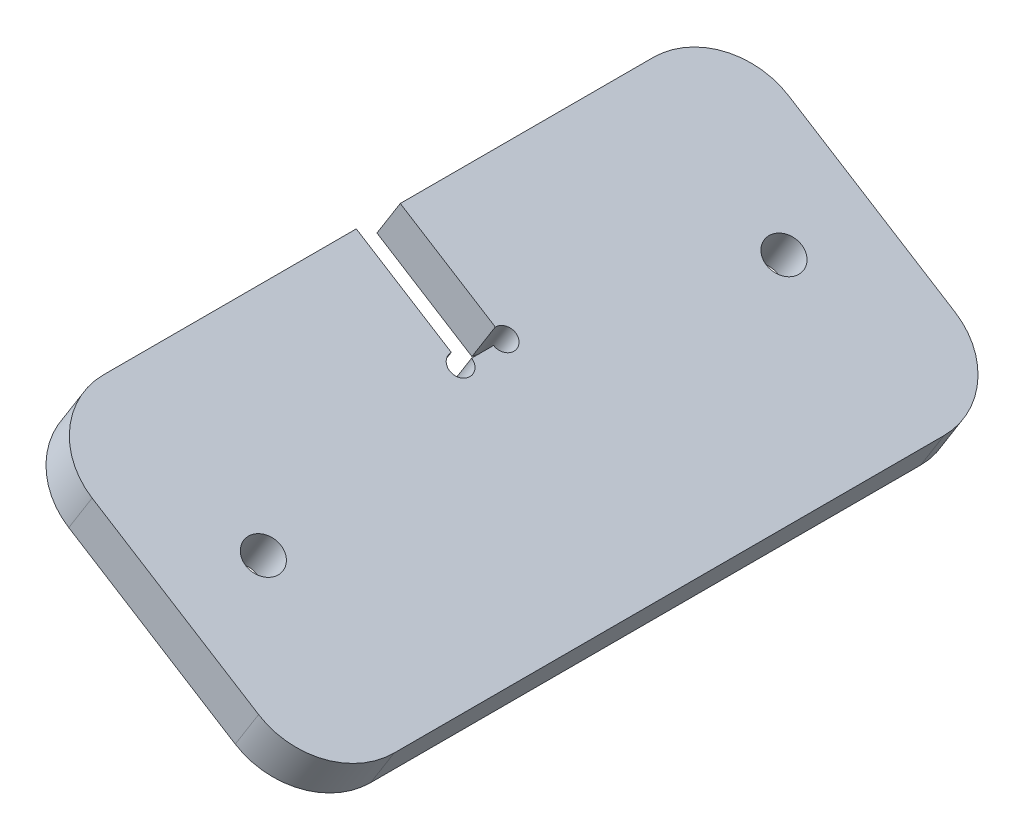
ISO-10303-21;
HEADER;
FILE_DESCRIPTION(('STEP AP214'),'2;1');
FILE_NAME('part.step','',(''),(''),'','','');
FILE_SCHEMA(('AUTOMOTIVE_DESIGN { 1 0 10303 214 1 1 1 1 }'));
ENDSEC;
DATA;
#1=APPLICATION_CONTEXT('core data for automotive mechanical design processes');
#2=APPLICATION_PROTOCOL_DEFINITION('international standard','automotive_design',2000,#1);
#3=PRODUCT_CONTEXT('',#1,'mechanical');
#4=PRODUCT('Part','Part','',(#3));
#5=PRODUCT_RELATED_PRODUCT_CATEGORY('part','',(#4));
#6=PRODUCT_DEFINITION_FORMATION('','',#4);
#7=PRODUCT_DEFINITION_CONTEXT('part definition',#1,'design');
#8=PRODUCT_DEFINITION('design','',#6,#7);
#9=PRODUCT_DEFINITION_SHAPE('','',#8);
#10=(LENGTH_UNIT() NAMED_UNIT(*) SI_UNIT(.MILLI.,.METRE.));
#11=(NAMED_UNIT(*) PLANE_ANGLE_UNIT() SI_UNIT($,.RADIAN.));
#12=(NAMED_UNIT(*) SI_UNIT($,.STERADIAN.) SOLID_ANGLE_UNIT());
#13=UNCERTAINTY_MEASURE_WITH_UNIT(LENGTH_MEASURE(1.E-05),#10,'distance_accuracy_value','');
#14=(GEOMETRIC_REPRESENTATION_CONTEXT(3) GLOBAL_UNCERTAINTY_ASSIGNED_CONTEXT((#13)) GLOBAL_UNIT_ASSIGNED_CONTEXT((#10,
#11,#12)) REPRESENTATION_CONTEXT('',''));
#15=CARTESIAN_POINT('',(0.,0.,0.));
#16=DIRECTION('',(0.,0.,1.));
#17=DIRECTION('',(1.,0.,0.));
#18=AXIS2_PLACEMENT_3D('',#15,#16,#17);
#19=CARTESIAN_POINT('',(698.573213094909,153.841859890101,54.9944512539106));
#20=DIRECTION('',(0.847559563503061,-0.530700279173188,0.));
#21=DIRECTION('',(0.530700279173188,0.847559563503061,0.));
#22=AXIS2_PLACEMENT_3D('',#19,#20,#21);
#23=PLANE('',#22);
#24=DIRECTION('',(0.,0.,-1.));
#25=VECTOR('',#24,1.);
#26=CARTESIAN_POINT('',(701.757414769948,158.92721727112,54.9944512539106));
#27=LINE('',#26,#25);
#28=CARTESIAN_POINT('',(701.757414769948,158.92721727112,-26.4999999999998));
#29=VERTEX_POINT('',#28);
#30=CARTESIAN_POINT('',(701.757414769948,158.92721727112,-29.4999999999995));
#31=VERTEX_POINT('',#30);
#32=EDGE_CURVE('E154',#29,#31,#27,.T.);
#33=ORIENTED_EDGE('',*,*,#32,.T.);
#34=DIRECTION('',(0.530700279173189,0.847559563503061,0.));
#35=VECTOR('',#34,1.);
#36=CARTESIAN_POINT('',(687.405090474651,136.005711117161,-29.4999999999995));
#37=LINE('',#36,#35);
#38=CARTESIAN_POINT('',(698.573213094909,153.841859890102,-29.4999999999995));
#39=VERTEX_POINT('',#38);
#40=EDGE_CURVE('E275',#31,#39,#37,.F.);
#41=ORIENTED_EDGE('',*,*,#40,.T.);
#42=DIRECTION('',(0.,0.,-1.));
#43=VECTOR('',#42,1.);
#44=CARTESIAN_POINT('',(698.573213094909,153.841859890101,54.9944512539106));
#45=LINE('',#44,#43);
#46=CARTESIAN_POINT('',(698.573213094909,153.841859890102,-26.4999999999998));
#47=VERTEX_POINT('',#46);
#48=EDGE_CURVE('E211',#47,#39,#45,.T.);
#49=ORIENTED_EDGE('',*,*,#48,.F.);
#50=DIRECTION('',(0.530700279173189,0.847559563503061,0.));
#51=VECTOR('',#50,1.);
#52=CARTESIAN_POINT('',(687.405090474651,136.005711117161,-26.4999999999998));
#53=LINE('',#52,#51);
#54=EDGE_CURVE('E289',#47,#29,#53,.T.);
#55=ORIENTED_EDGE('',*,*,#54,.T.);
#56=EDGE_LOOP('',(#33,#41,#49,#55));
#57=FACE_BOUND('',#56,.T.);
#58=ADVANCED_FACE('F36',(#57),#23,.F.);
#59=CARTESIAN_POINT('',(724.,137.920851514906,54.9944512539106));
#60=DIRECTION('',(-0.847559563503063,0.530700279173186,0.));
#61=DIRECTION('',(-0.530700279173186,-0.847559563503063,0.));
#62=AXIS2_PLACEMENT_3D('',#59,#60,#61);
#63=PLANE('',#62);
#64=DIRECTION('',(0.,0.,-1.));
#65=VECTOR('',#64,1.);
#66=CARTESIAN_POINT('',(724.,137.920851514906,54.9944512539106));
#67=LINE('',#66,#65);
#68=CARTESIAN_POINT('',(724.,137.920851514906,9.50000000000024));
#69=VERTEX_POINT('',#68);
#70=CARTESIAN_POINT('',(724.,137.920851514906,-65.4999999999995));
#71=VERTEX_POINT('',#70);
#72=EDGE_CURVE('E202',#69,#71,#67,.T.);
#73=ORIENTED_EDGE('',*,*,#72,.T.);
#74=DIRECTION('',(0.530700279173186,0.847559563503063,0.));
#75=VECTOR('',#74,1.);
#76=CARTESIAN_POINT('',(727.184201675039,143.006208895924,-65.4999999999995));
#77=LINE('',#76,#75);
#78=CARTESIAN_POINT('',(727.184201675039,143.006208895924,-65.4999999999995));
#79=VERTEX_POINT('',#78);
#80=EDGE_CURVE('E226',#71,#79,#77,.T.);
#81=ORIENTED_EDGE('',*,*,#80,.T.);
#82=DIRECTION('',(0.,0.,-1.));
#83=VECTOR('',#82,1.);
#84=CARTESIAN_POINT('',(727.184201675039,143.006208895924,54.9944512539106));
#85=LINE('',#84,#83);
#86=CARTESIAN_POINT('',(727.184201675039,143.006208895924,9.50000000000024));
#87=VERTEX_POINT('',#86);
#88=EDGE_CURVE('E212',#87,#79,#85,.T.);
#89=ORIENTED_EDGE('',*,*,#88,.F.);
#90=DIRECTION('',(0.530700279173186,0.847559563503063,0.));
#91=VECTOR('',#90,1.);
#92=CARTESIAN_POINT('',(724.,137.920851514906,9.50000000000024));
#93=LINE('',#92,#91);
#94=EDGE_CURVE('E207',#87,#69,#93,.F.);
#95=ORIENTED_EDGE('',*,*,#94,.T.);
#96=EDGE_LOOP('',(#73,#81,#89,#95));
#97=FACE_BOUND('',#96,.T.);
#98=ADVANCED_FACE('F314',(#97),#63,.F.);
#99=CARTESIAN_POINT('',(727.184201675039,143.006208895924,54.9944512539106));
#100=DIRECTION('',(-0.530700279173189,-0.847559563503061,0.));
#101=DIRECTION('',(0.847559563503061,-0.530700279173189,0.));
#102=AXIS2_PLACEMENT_3D('',#99,#100,#101);
#103=PLANE('',#102);
#104=CARTESIAN_POINT('',(707.357450977107,155.420748927779,-63.4999999999995));
#105=DIRECTION('',(0.530700279173189,0.847559563503061,0.));
#106=DIRECTION('',(0.847559563503061,-0.530700279173189,0.));
#107=AXIS2_PLACEMENT_3D('',#104,#105,#106);
#108=CIRCLE('',#107,2.40000000000009);
#109=CARTESIAN_POINT('',(709.391593929514,154.147068257763,-63.4999999999995));
#110=VERTEX_POINT('',#109);
#111=EDGE_CURVE('E346',#110,#110,#108,.T.);
#112=ORIENTED_EDGE('',*,*,#111,.F.);
#113=EDGE_LOOP('',(#112));
#114=FACE_BOUND('',#113,.T.);
#115=CARTESIAN_POINT('',(707.357450977107,155.420748927779,7.50000000000024));
#116=DIRECTION('',(0.530700279173189,0.847559563503061,0.));
#117=DIRECTION('',(-0.847559563503061,0.530700279173189,0.));
#118=AXIS2_PLACEMENT_3D('',#115,#116,#117);
#119=CIRCLE('',#118,2.40000000000009);
#120=CARTESIAN_POINT('',(705.323308024699,156.694429597795,7.50000000000024));
#121=VERTEX_POINT('',#120);
#122=EDGE_CURVE('E340',#121,#121,#119,.T.);
#123=ORIENTED_EDGE('',*,*,#122,.F.);
#124=EDGE_LOOP('',(#123));
#125=FACE_BOUND('',#124,.T.);
#126=DIRECTION('',(0.847559563503061,-0.530700279173189,0.));
#127=VECTOR('',#126,1.);
#128=CARTESIAN_POINT('',(687.530700279174,167.835288959634,-30.9999999999996));
#129=LINE('',#128,#127);
#130=CARTESIAN_POINT('',(687.530700279174,167.835288959634,-30.9999999999996));
#131=VERTEX_POINT('',#130);
#132=CARTESIAN_POINT('',(700.486075424693,159.72326768988,-30.9999999999996));
#133=VERTEX_POINT('',#132);
#134=EDGE_CURVE('E182',#131,#133,#129,.T.);
#135=ORIENTED_EDGE('',*,*,#134,.T.);
#136=CARTESIAN_POINT('',(701.757414769948,158.92721727112,-30.9999999999996));
#137=DIRECTION('',(0.530700279173189,0.847559563503061,0.));
#138=DIRECTION('',(-0.847559563503061,0.530700279173189,0.));
#139=AXIS2_PLACEMENT_3D('',#136,#137,#138);
#140=CIRCLE('',#139,1.50000000000013);
#141=EDGE_CURVE('E53',#31,#133,#140,.T.);
#142=ORIENTED_EDGE('',*,*,#141,.F.);
#143=ORIENTED_EDGE('',*,*,#32,.F.);
#144=CARTESIAN_POINT('',(701.757414769948,158.92721727112,-24.9999999999996));
#145=DIRECTION('',(0.530700279173189,0.847559563503061,0.));
#146=DIRECTION('',(-0.847559563503061,0.530700279173189,0.));
#147=AXIS2_PLACEMENT_3D('',#144,#145,#146);
#148=CIRCLE('',#147,1.50000000000013);
#149=CARTESIAN_POINT('',(700.486075424693,159.723267689879,-24.9999999999996));
#150=VERTEX_POINT('',#149);
#151=EDGE_CURVE('E138',#150,#29,#148,.T.);
#152=ORIENTED_EDGE('',*,*,#151,.F.);
#153=DIRECTION('',(-0.847559563503061,0.530700279173189,0.));
#154=VECTOR('',#153,1.);
#155=CARTESIAN_POINT('',(687.530700279174,167.835288959634,-24.9999999999996));
#156=LINE('',#155,#154);
#157=CARTESIAN_POINT('',(687.530700279174,167.835288959634,-24.9999999999996));
#158=VERTEX_POINT('',#157);
#159=EDGE_CURVE('E151',#150,#158,#156,.T.);
#160=ORIENTED_EDGE('',*,*,#159,.T.);
#161=DIRECTION('',(0.,0.,1.));
#162=VECTOR('',#161,1.);
#163=CARTESIAN_POINT('',(687.530700279174,167.835288959634,-24.9999999999996));
#164=LINE('',#163,#162);
#165=CARTESIAN_POINT('',(687.530700279174,167.835288959634,9.50000000000024));
#166=VERTEX_POINT('',#165);
#167=EDGE_CURVE('E163',#158,#166,#164,.T.);
#168=ORIENTED_EDGE('',*,*,#167,.T.);
#169=CARTESIAN_POINT('',(696.006295914205,162.528286167902,9.50000000000024));
#170=DIRECTION('',(-0.530700279173189,-0.847559563503061,0.));
#171=DIRECTION('',(0.847559563503061,-0.530700279173189,0.));
#172=AXIS2_PLACEMENT_3D('',#169,#170,#171);
#173=CIRCLE('',#172,10.);
#174=CARTESIAN_POINT('',(696.006295914205,162.528286167902,19.5000000000002));
#175=VERTEX_POINT('',#174);
#176=EDGE_CURVE('E233',#166,#175,#173,.F.);
#177=ORIENTED_EDGE('',*,*,#176,.T.);
#178=DIRECTION('',(-0.847559563503061,0.530700279173189,0.));
#179=VECTOR('',#178,1.);
#180=CARTESIAN_POINT('',(727.184201675039,143.006208895924,19.5000000000002));
#181=LINE('',#180,#179);
#182=CARTESIAN_POINT('',(718.708606040009,148.313211687656,19.5000000000002));
#183=VERTEX_POINT('',#182);
#184=EDGE_CURVE('E203',#183,#175,#181,.T.);
#185=ORIENTED_EDGE('',*,*,#184,.F.);
#186=CARTESIAN_POINT('',(718.708606040009,148.313211687656,9.50000000000024));
#187=DIRECTION('',(-0.530700279173189,-0.847559563503061,0.));
#188=DIRECTION('',(0.847559563503061,-0.530700279173189,0.));
#189=AXIS2_PLACEMENT_3D('',#186,#187,#188);
#190=CIRCLE('',#189,10.);
#191=EDGE_CURVE('E230',#183,#87,#190,.F.);
#192=ORIENTED_EDGE('',*,*,#191,.T.);
#193=ORIENTED_EDGE('',*,*,#88,.T.);
#194=CARTESIAN_POINT('',(718.708606040009,148.313211687656,-65.4999999999995));
#195=DIRECTION('',(-0.530700279173189,-0.847559563503061,0.));
#196=DIRECTION('',(0.847559563503061,-0.530700279173189,0.));
#197=AXIS2_PLACEMENT_3D('',#194,#195,#196);
#198=CIRCLE('',#197,10.);
#199=CARTESIAN_POINT('',(718.708606040009,148.313211687656,-75.4999999999995));
#200=VERTEX_POINT('',#199);
#201=EDGE_CURVE('E239',#79,#200,#198,.F.);
#202=ORIENTED_EDGE('',*,*,#201,.T.);
#203=DIRECTION('',(-0.847559563503061,0.530700279173189,0.));
#204=VECTOR('',#203,1.);
#205=CARTESIAN_POINT('',(727.184201675039,143.006208895924,-75.4999999999995));
#206=LINE('',#205,#204);
#207=CARTESIAN_POINT('',(696.006295914205,162.528286167902,-75.4999999999995));
#208=VERTEX_POINT('',#207);
#209=EDGE_CURVE('E194',#200,#208,#206,.T.);
#210=ORIENTED_EDGE('',*,*,#209,.T.);
#211=CARTESIAN_POINT('',(696.006295914205,162.528286167902,-65.4999999999995));
#212=DIRECTION('',(-0.530700279173189,-0.847559563503061,0.));
#213=DIRECTION('',(0.847559563503061,-0.530700279173189,0.));
#214=AXIS2_PLACEMENT_3D('',#211,#212,#213);
#215=CIRCLE('',#214,10.);
#216=CARTESIAN_POINT('',(687.530700279174,167.835288959634,-65.4999999999995));
#217=VERTEX_POINT('',#216);
#218=EDGE_CURVE('E236',#208,#217,#215,.F.);
#219=ORIENTED_EDGE('',*,*,#218,.T.);
#220=DIRECTION('',(0.,0.,1.));
#221=VECTOR('',#220,1.);
#222=CARTESIAN_POINT('',(687.530700279174,167.835288959634,-75.4999999999995));
#223=LINE('',#222,#221);
#224=EDGE_CURVE('E177',#217,#131,#223,.T.);
#225=ORIENTED_EDGE('',*,*,#224,.T.);
#226=EDGE_LOOP('',(#135,#142,#143,#152,#160,#168,#177,#185,#192,#193,#202,#210,#219,#225));
#227=FACE_BOUND('',#226,.T.);
#228=ADVANCED_FACE('F149',(#114,#125,#227),#103,.F.);
#229=CARTESIAN_POINT('',(724.,137.920851514906,54.9944512539106));
#230=DIRECTION('',(0.53070027917319,0.84755956350306,0.));
#231=DIRECTION('',(-0.84755956350306,0.53070027917319,0.));
#232=AXIS2_PLACEMENT_3D('',#229,#230,#231);
#233=PLANE('',#232);
#234=CARTESIAN_POINT('',(704.173249302068,150.335391546761,-63.4999999999995));
#235=DIRECTION('',(0.53070027917319,0.84755956350306,0.));
#236=DIRECTION('',(-0.84755956350306,0.53070027917319,0.));
#237=AXIS2_PLACEMENT_3D('',#234,#235,#236);
#238=CIRCLE('',#237,2.40000000000009);
#239=CARTESIAN_POINT('',(702.13910634966,151.609072216776,-63.4999999999995));
#240=VERTEX_POINT('',#239);
#241=EDGE_CURVE('E40',#240,#240,#238,.T.);
#242=ORIENTED_EDGE('',*,*,#241,.T.);
#243=EDGE_LOOP('',(#242));
#244=FACE_BOUND('',#243,.T.);
#245=CARTESIAN_POINT('',(704.173249302068,150.335391546761,7.50000000000024));
#246=DIRECTION('',(0.53070027917319,0.84755956350306,0.));
#247=DIRECTION('',(-0.84755956350306,0.53070027917319,0.));
#248=AXIS2_PLACEMENT_3D('',#245,#246,#247);
#249=CIRCLE('',#248,2.40000000000009);
#250=CARTESIAN_POINT('',(702.13910634966,151.609072216776,7.50000000000024));
#251=VERTEX_POINT('',#250);
#252=EDGE_CURVE('E272',#251,#251,#249,.T.);
#253=ORIENTED_EDGE('',*,*,#252,.T.);
#254=EDGE_LOOP('',(#253));
#255=FACE_BOUND('',#254,.T.);
#256=ORIENTED_EDGE('',*,*,#48,.T.);
#257=CARTESIAN_POINT('',(698.573213094909,153.841859890101,-30.9999999999996));
#258=DIRECTION('',(0.53070027917319,0.84755956350306,0.));
#259=DIRECTION('',(-0.84755956350306,0.53070027917319,0.));
#260=AXIS2_PLACEMENT_3D('',#257,#258,#259);
#261=CIRCLE('',#260,1.50000000000013);
#262=CARTESIAN_POINT('',(697.301873749654,154.637910308861,-30.9999999999996));
#263=VERTEX_POINT('',#262);
#264=EDGE_CURVE('E283',#39,#263,#261,.T.);
#265=ORIENTED_EDGE('',*,*,#264,.T.);
#266=DIRECTION('',(0.847559563503061,-0.530700279173189,0.));
#267=VECTOR('',#266,1.);
#268=CARTESIAN_POINT('',(684.346498604135,162.749931578615,-30.9999999999996));
#269=LINE('',#268,#267);
#270=CARTESIAN_POINT('',(684.346498604135,162.749931578615,-30.9999999999996));
#271=VERTEX_POINT('',#270);
#272=EDGE_CURVE('E181',#271,#263,#269,.T.);
#273=ORIENTED_EDGE('',*,*,#272,.F.);
#274=DIRECTION('',(0.,0.,1.));
#275=VECTOR('',#274,1.);
#276=CARTESIAN_POINT('',(684.346498604135,162.749931578615,-75.4999999999995));
#277=LINE('',#276,#275);
#278=CARTESIAN_POINT('',(684.346498604135,162.749931578615,-65.4999999999995));
#279=VERTEX_POINT('',#278);
#280=EDGE_CURVE('E178',#279,#271,#277,.T.);
#281=ORIENTED_EDGE('',*,*,#280,.F.);
#282=CARTESIAN_POINT('',(692.822094239165,157.442928786883,-65.4999999999995));
#283=DIRECTION('',(0.53070027917319,0.84755956350306,0.));
#284=DIRECTION('',(-0.84755956350306,0.53070027917319,0.));
#285=AXIS2_PLACEMENT_3D('',#282,#283,#284);
#286=CIRCLE('',#285,10.);
#287=CARTESIAN_POINT('',(692.822094239165,157.442928786883,-75.4999999999995));
#288=VERTEX_POINT('',#287);
#289=EDGE_CURVE('E254',#279,#288,#286,.F.);
#290=ORIENTED_EDGE('',*,*,#289,.T.);
#291=DIRECTION('',(0.84755956350306,-0.53070027917319,0.));
#292=VECTOR('',#291,1.);
#293=CARTESIAN_POINT('',(724.,137.920851514906,-75.4999999999995));
#294=LINE('',#293,#292);
#295=CARTESIAN_POINT('',(715.52440436497,143.227854306638,-75.4999999999995));
#296=VERTEX_POINT('',#295);
#297=EDGE_CURVE('E198',#288,#296,#294,.T.);
#298=ORIENTED_EDGE('',*,*,#297,.T.);
#299=CARTESIAN_POINT('',(715.52440436497,143.227854306638,-65.4999999999995));
#300=DIRECTION('',(0.53070027917319,0.84755956350306,0.));
#301=DIRECTION('',(-0.84755956350306,0.53070027917319,0.));
#302=AXIS2_PLACEMENT_3D('',#299,#300,#301);
#303=CIRCLE('',#302,10.);
#304=EDGE_CURVE('E257',#296,#71,#303,.F.);
#305=ORIENTED_EDGE('',*,*,#304,.T.);
#306=ORIENTED_EDGE('',*,*,#72,.F.);
#307=CARTESIAN_POINT('',(715.52440436497,143.227854306638,9.50000000000024));
#308=DIRECTION('',(0.53070027917319,0.84755956350306,0.));
#309=DIRECTION('',(-0.84755956350306,0.53070027917319,0.));
#310=AXIS2_PLACEMENT_3D('',#307,#308,#309);
#311=CIRCLE('',#310,10.);
#312=CARTESIAN_POINT('',(715.52440436497,143.227854306638,19.5000000000002));
#313=VERTEX_POINT('',#312);
#314=EDGE_CURVE('E248',#69,#313,#311,.F.);
#315=ORIENTED_EDGE('',*,*,#314,.T.);
#316=DIRECTION('',(0.84755956350306,-0.53070027917319,0.));
#317=VECTOR('',#316,1.);
#318=CARTESIAN_POINT('',(724.,137.920851514906,19.5000000000002));
#319=LINE('',#318,#317);
#320=CARTESIAN_POINT('',(692.822094239165,157.442928786883,19.5000000000002));
#321=VERTEX_POINT('',#320);
#322=EDGE_CURVE('E208',#321,#313,#319,.T.);
#323=ORIENTED_EDGE('',*,*,#322,.F.);
#324=CARTESIAN_POINT('',(692.822094239165,157.442928786883,9.50000000000024));
#325=DIRECTION('',(0.53070027917319,0.84755956350306,0.));
#326=DIRECTION('',(-0.84755956350306,0.53070027917319,0.));
#327=AXIS2_PLACEMENT_3D('',#324,#325,#326);
#328=CIRCLE('',#327,10.);
#329=CARTESIAN_POINT('',(684.346498604135,162.749931578615,9.50000000000024));
#330=VERTEX_POINT('',#329);
#331=EDGE_CURVE('E251',#321,#330,#328,.F.);
#332=ORIENTED_EDGE('',*,*,#331,.T.);
#333=DIRECTION('',(0.,0.,1.));
#334=VECTOR('',#333,1.);
#335=CARTESIAN_POINT('',(684.346498604135,162.749931578615,-24.9999999999996));
#336=LINE('',#335,#334);
#337=CARTESIAN_POINT('',(684.346498604135,162.749931578615,-24.9999999999996));
#338=VERTEX_POINT('',#337);
#339=EDGE_CURVE('E162',#338,#330,#336,.T.);
#340=ORIENTED_EDGE('',*,*,#339,.F.);
#341=DIRECTION('',(-0.847559563503061,0.530700279173189,0.));
#342=VECTOR('',#341,1.);
#343=CARTESIAN_POINT('',(684.346498604135,162.749931578615,-24.9999999999996));
#344=LINE('',#343,#342);
#345=CARTESIAN_POINT('',(697.301873749654,154.637910308861,-24.9999999999996));
#346=VERTEX_POINT('',#345);
#347=EDGE_CURVE('E169',#346,#338,#344,.T.);
#348=ORIENTED_EDGE('',*,*,#347,.F.);
#349=CARTESIAN_POINT('',(698.573213094909,153.841859890101,-24.9999999999996));
#350=DIRECTION('',(0.53070027917319,0.84755956350306,0.));
#351=DIRECTION('',(-0.84755956350306,0.53070027917319,0.));
#352=AXIS2_PLACEMENT_3D('',#349,#350,#351);
#353=CIRCLE('',#352,1.50000000000013);
#354=EDGE_CURVE('E61',#346,#47,#353,.T.);
#355=ORIENTED_EDGE('',*,*,#354,.T.);
#356=EDGE_LOOP('',(#256,#265,#273,#281,#290,#298,#305,#306,#315,#323,#332,#340,#348,#355));
#357=FACE_BOUND('',#356,.T.);
#358=ADVANCED_FACE('F299',(#244,#255,#357),#233,.F.);
#359=CARTESIAN_POINT('',(724.,131.,19.5000000000002));
#360=DIRECTION('',(0.,0.,1.));
#361=DIRECTION('',(0.,-1.,0.));
#362=AXIS2_PLACEMENT_3D('',#359,#360,#361);
#363=PLANE('',#362);
#364=ORIENTED_EDGE('',*,*,#184,.T.);
#365=DIRECTION('',(0.530700279173189,0.847559563503061,0.));
#366=VECTOR('',#365,1.);
#367=CARTESIAN_POINT('',(689.709094556667,152.471285176304,19.5000000000002));
#368=LINE('',#367,#366);
#369=EDGE_CURVE('E144',#175,#321,#368,.F.);
#370=ORIENTED_EDGE('',*,*,#369,.T.);
#371=ORIENTED_EDGE('',*,*,#322,.T.);
#372=DIRECTION('',(0.530700279173186,0.847559563503063,0.));
#373=VECTOR('',#372,1.);
#374=CARTESIAN_POINT('',(718.708606040009,148.313211687656,19.5000000000002));
#375=LINE('',#374,#373);
#376=EDGE_CURVE('E267',#313,#183,#375,.T.);
#377=ORIENTED_EDGE('',*,*,#376,.T.);
#378=EDGE_LOOP('',(#364,#370,#371,#377));
#379=FACE_BOUND('',#378,.T.);
#380=ADVANCED_FACE('F307',(#379),#363,.T.);
#381=CARTESIAN_POINT('',(724.,131.,-75.4999999999995));
#382=DIRECTION('',(0.,0.,-1.));
#383=DIRECTION('',(0.,1.,0.));
#384=AXIS2_PLACEMENT_3D('',#381,#382,#383);
#385=PLANE('',#384);
#386=ORIENTED_EDGE('',*,*,#209,.F.);
#387=DIRECTION('',(0.530700279173186,0.847559563503063,0.));
#388=VECTOR('',#387,1.);
#389=CARTESIAN_POINT('',(715.52440436497,143.227854306638,-75.4999999999995));
#390=LINE('',#389,#388);
#391=EDGE_CURVE('E245',#200,#296,#390,.F.);
#392=ORIENTED_EDGE('',*,*,#391,.T.);
#393=ORIENTED_EDGE('',*,*,#297,.F.);
#394=DIRECTION('',(0.530700279173189,0.847559563503061,0.));
#395=VECTOR('',#394,1.);
#396=CARTESIAN_POINT('',(689.709094556667,152.471285176304,-75.4999999999995));
#397=LINE('',#396,#395);
#398=EDGE_CURVE('E241',#288,#208,#397,.T.);
#399=ORIENTED_EDGE('',*,*,#398,.T.);
#400=EDGE_LOOP('',(#386,#392,#393,#399));
#401=FACE_BOUND('',#400,.T.);
#402=ADVANCED_FACE('F323',(#401),#385,.T.);
#403=CARTESIAN_POINT('',(684.346498604135,162.749931578615,-30.9999999999996));
#404=DIRECTION('',(0.,0.,1.));
#405=DIRECTION('',(1.,0.,0.));
#406=AXIS2_PLACEMENT_3D('',#403,#404,#405);
#407=PLANE('',#406);
#408=DIRECTION('',(0.530700279173189,0.847559563503061,0.));
#409=VECTOR('',#408,1.);
#410=CARTESIAN_POINT('',(686.133751129397,136.801761535921,-30.9999999999996));
#411=LINE('',#410,#409);
#412=EDGE_CURVE('E11',#133,#263,#411,.F.);
#413=ORIENTED_EDGE('',*,*,#412,.F.);
#414=ORIENTED_EDGE('',*,*,#134,.F.);
#415=DIRECTION('',(0.530700279173189,0.847559563503061,0.));
#416=VECTOR('',#415,1.);
#417=CARTESIAN_POINT('',(684.346498604135,162.749931578615,-30.9999999999996));
#418=LINE('',#417,#416);
#419=EDGE_CURVE('E186',#271,#131,#418,.T.);
#420=ORIENTED_EDGE('',*,*,#419,.F.);
#421=ORIENTED_EDGE('',*,*,#272,.T.);
#422=EDGE_LOOP('',(#413,#414,#420,#421));
#423=FACE_BOUND('',#422,.T.);
#424=ADVANCED_FACE('F338',(#423),#407,.T.);
#425=CARTESIAN_POINT('',(684.346498604135,162.749931578615,-75.4999999999995));
#426=DIRECTION('',(-0.847559563503061,0.530700279173189,0.));
#427=DIRECTION('',(-0.530700279173189,-0.847559563503061,0.));
#428=AXIS2_PLACEMENT_3D('',#425,#426,#427);
#429=PLANE('',#428);
#430=ORIENTED_EDGE('',*,*,#224,.F.);
#431=DIRECTION('',(0.530700279173189,0.847559563503061,0.));
#432=VECTOR('',#431,1.);
#433=CARTESIAN_POINT('',(684.346498604135,162.749931578615,-65.4999999999995));
#434=LINE('',#433,#432);
#435=EDGE_CURVE('E260',#217,#279,#434,.F.);
#436=ORIENTED_EDGE('',*,*,#435,.T.);
#437=ORIENTED_EDGE('',*,*,#280,.T.);
#438=ORIENTED_EDGE('',*,*,#419,.T.);
#439=EDGE_LOOP('',(#430,#436,#437,#438));
#440=FACE_BOUND('',#439,.T.);
#441=ADVANCED_FACE('F332',(#440),#429,.T.);
#442=CARTESIAN_POINT('',(684.346498604135,162.749931578615,-24.9999999999996));
#443=DIRECTION('',(-0.847559563503061,0.530700279173189,0.));
#444=DIRECTION('',(-0.530700279173189,-0.847559563503061,0.));
#445=AXIS2_PLACEMENT_3D('',#442,#443,#444);
#446=PLANE('',#445);
#447=ORIENTED_EDGE('',*,*,#339,.T.);
#448=DIRECTION('',(0.530700279173189,0.847559563503061,0.));
#449=VECTOR('',#448,1.);
#450=CARTESIAN_POINT('',(684.346498604135,162.749931578615,9.50000000000024));
#451=LINE('',#450,#449);
#452=EDGE_CURVE('E263',#330,#166,#451,.T.);
#453=ORIENTED_EDGE('',*,*,#452,.T.);
#454=ORIENTED_EDGE('',*,*,#167,.F.);
#455=DIRECTION('',(0.530700279173189,0.847559563503061,0.));
#456=VECTOR('',#455,1.);
#457=CARTESIAN_POINT('',(684.346498604135,162.749931578615,-24.9999999999996));
#458=LINE('',#457,#456);
#459=EDGE_CURVE('E159',#338,#158,#458,.T.);
#460=ORIENTED_EDGE('',*,*,#459,.F.);
#461=EDGE_LOOP('',(#447,#453,#454,#460));
#462=FACE_BOUND('',#461,.T.);
#463=ADVANCED_FACE('F297',(#462),#446,.T.);
#464=CARTESIAN_POINT('',(684.346498604135,162.749931578615,-24.9999999999996));
#465=DIRECTION('',(0.,0.,-1.));
#466=DIRECTION('',(-1.,0.,0.));
#467=AXIS2_PLACEMENT_3D('',#464,#465,#466);
#468=PLANE('',#467);
#469=DIRECTION('',(0.530700279173189,0.847559563503061,0.));
#470=VECTOR('',#469,1.);
#471=CARTESIAN_POINT('',(686.133751129397,136.801761535921,-24.9999999999996));
#472=LINE('',#471,#470);
#473=EDGE_CURVE('E46',#346,#150,#472,.T.);
#474=ORIENTED_EDGE('',*,*,#473,.F.);
#475=ORIENTED_EDGE('',*,*,#347,.T.);
#476=ORIENTED_EDGE('',*,*,#459,.T.);
#477=ORIENTED_EDGE('',*,*,#159,.F.);
#478=EDGE_LOOP('',(#474,#475,#476,#477));
#479=FACE_BOUND('',#478,.T.);
#480=ADVANCED_FACE('F157',(#479),#468,.T.);
#481=CARTESIAN_POINT('',(715.52440436497,143.227854306638,-65.4999999999995));
#482=DIRECTION('',(-0.530700279173186,-0.847559563503063,0.));
#483=DIRECTION('',(0.847559563503063,-0.530700279173186,0.));
#484=AXIS2_PLACEMENT_3D('',#481,#482,#483);
#485=CYLINDRICAL_SURFACE('',#484,10.);
#486=ORIENTED_EDGE('',*,*,#304,.F.);
#487=ORIENTED_EDGE('',*,*,#391,.F.);
#488=ORIENTED_EDGE('',*,*,#201,.F.);
#489=ORIENTED_EDGE('',*,*,#80,.F.);
#490=EDGE_LOOP('',(#486,#487,#488,#489));
#491=FACE_BOUND('',#490,.T.);
#492=ADVANCED_FACE('F319',(#491),#485,.T.);
#493=CARTESIAN_POINT('',(689.709094556667,152.471285176304,-65.4999999999995));
#494=DIRECTION('',(0.530700279173189,0.847559563503061,0.));
#495=DIRECTION('',(-0.847559563503061,0.530700279173189,0.));
#496=AXIS2_PLACEMENT_3D('',#493,#494,#495);
#497=CYLINDRICAL_SURFACE('',#496,10.);
#498=ORIENTED_EDGE('',*,*,#289,.F.);
#499=ORIENTED_EDGE('',*,*,#435,.F.);
#500=ORIENTED_EDGE('',*,*,#218,.F.);
#501=ORIENTED_EDGE('',*,*,#398,.F.);
#502=EDGE_LOOP('',(#498,#499,#500,#501));
#503=FACE_BOUND('',#502,.T.);
#504=ADVANCED_FACE('F328',(#503),#497,.T.);
#505=CARTESIAN_POINT('',(692.822094239165,157.442928786884,9.50000000000024));
#506=DIRECTION('',(0.530700279173189,0.847559563503061,0.));
#507=DIRECTION('',(-0.847559563503061,0.530700279173189,0.));
#508=AXIS2_PLACEMENT_3D('',#505,#506,#507);
#509=CYLINDRICAL_SURFACE('',#508,10.);
#510=ORIENTED_EDGE('',*,*,#331,.F.);
#511=ORIENTED_EDGE('',*,*,#369,.F.);
#512=ORIENTED_EDGE('',*,*,#176,.F.);
#513=ORIENTED_EDGE('',*,*,#452,.F.);
#514=EDGE_LOOP('',(#510,#511,#512,#513));
#515=FACE_BOUND('',#514,.T.);
#516=ADVANCED_FACE('F304',(#515),#509,.T.);
#517=CARTESIAN_POINT('',(712.411404682471,138.256210696059,9.50000000000024));
#518=DIRECTION('',(-0.530700279173186,-0.847559563503063,0.));
#519=DIRECTION('',(0.847559563503063,-0.530700279173186,0.));
#520=AXIS2_PLACEMENT_3D('',#517,#518,#519);
#521=CYLINDRICAL_SURFACE('',#520,10.);
#522=ORIENTED_EDGE('',*,*,#314,.F.);
#523=ORIENTED_EDGE('',*,*,#94,.F.);
#524=ORIENTED_EDGE('',*,*,#191,.F.);
#525=ORIENTED_EDGE('',*,*,#376,.F.);
#526=EDGE_LOOP('',(#522,#523,#524,#525));
#527=FACE_BOUND('',#526,.T.);
#528=ADVANCED_FACE('F38',(#527),#521,.T.);
#529=CARTESIAN_POINT('',(687.405090474651,136.005711117161,-24.9999999999996));
#530=DIRECTION('',(0.530700279173189,0.847559563503061,0.));
#531=DIRECTION('',(-0.847559563503061,0.530700279173189,0.));
#532=AXIS2_PLACEMENT_3D('',#529,#530,#531);
#533=CYLINDRICAL_SURFACE('',#532,1.50000000000013);
#534=ORIENTED_EDGE('',*,*,#354,.F.);
#535=ORIENTED_EDGE('',*,*,#473,.T.);
#536=ORIENTED_EDGE('',*,*,#151,.T.);
#537=ORIENTED_EDGE('',*,*,#54,.F.);
#538=EDGE_LOOP('',(#534,#535,#536,#537));
#539=FACE_BOUND('',#538,.T.);
#540=ADVANCED_FACE('F137',(#539),#533,.F.);
#541=CARTESIAN_POINT('',(687.405090474651,136.005711117161,-30.9999999999996));
#542=DIRECTION('',(0.530700279173189,0.847559563503061,0.));
#543=DIRECTION('',(-0.847559563503061,0.530700279173189,0.));
#544=AXIS2_PLACEMENT_3D('',#541,#542,#543);
#545=CYLINDRICAL_SURFACE('',#544,1.50000000000013);
#546=ORIENTED_EDGE('',*,*,#141,.T.);
#547=ORIENTED_EDGE('',*,*,#412,.T.);
#548=ORIENTED_EDGE('',*,*,#264,.F.);
#549=ORIENTED_EDGE('',*,*,#40,.F.);
#550=EDGE_LOOP('',(#546,#547,#548,#549));
#551=FACE_BOUND('',#550,.T.);
#552=ADVANCED_FACE('F383',(#551),#545,.F.);
#553=CARTESIAN_POINT('',(693.00512668181,132.49924277382,7.50000000000024));
#554=DIRECTION('',(0.530700279173189,0.847559563503061,0.));
#555=DIRECTION('',(-0.847559563503061,0.530700279173189,0.));
#556=AXIS2_PLACEMENT_3D('',#553,#554,#555);
#557=CYLINDRICAL_SURFACE('',#556,2.40000000000009);
#558=ORIENTED_EDGE('',*,*,#122,.T.);
#559=EDGE_LOOP('',(#558));
#560=FACE_BOUND('',#559,.T.);
#561=ORIENTED_EDGE('',*,*,#252,.F.);
#562=EDGE_LOOP('',(#561));
#563=FACE_BOUND('',#562,.T.);
#564=ADVANCED_FACE('F352',(#560,#563),#557,.F.);
#565=CARTESIAN_POINT('',(693.00512668181,132.49924277382,-63.4999999999995));
#566=DIRECTION('',(0.530700279173189,0.847559563503061,0.));
#567=DIRECTION('',(-0.847559563503061,0.530700279173189,0.));
#568=AXIS2_PLACEMENT_3D('',#565,#566,#567);
#569=CYLINDRICAL_SURFACE('',#568,2.40000000000009);
#570=ORIENTED_EDGE('',*,*,#111,.T.);
#571=EDGE_LOOP('',(#570));
#572=FACE_BOUND('',#571,.T.);
#573=ORIENTED_EDGE('',*,*,#241,.F.);
#574=EDGE_LOOP('',(#573));
#575=FACE_BOUND('',#574,.T.);
#576=ADVANCED_FACE('F384',(#572,#575),#569,.F.);
#577=CLOSED_SHELL('',(#58,#98,#228,#358,#380,#402,#424,#441,#463,#480,#492,#504,#516,#528,#540,
#552,#564,#576));
#578=MANIFOLD_SOLID_BREP('B2',#577);
#579=ADVANCED_BREP_SHAPE_REPRESENTATION('',(#18,#578),#14);
#580=SHAPE_DEFINITION_REPRESENTATION(#9,#579);
ENDSEC;
END-ISO-10303-21;
